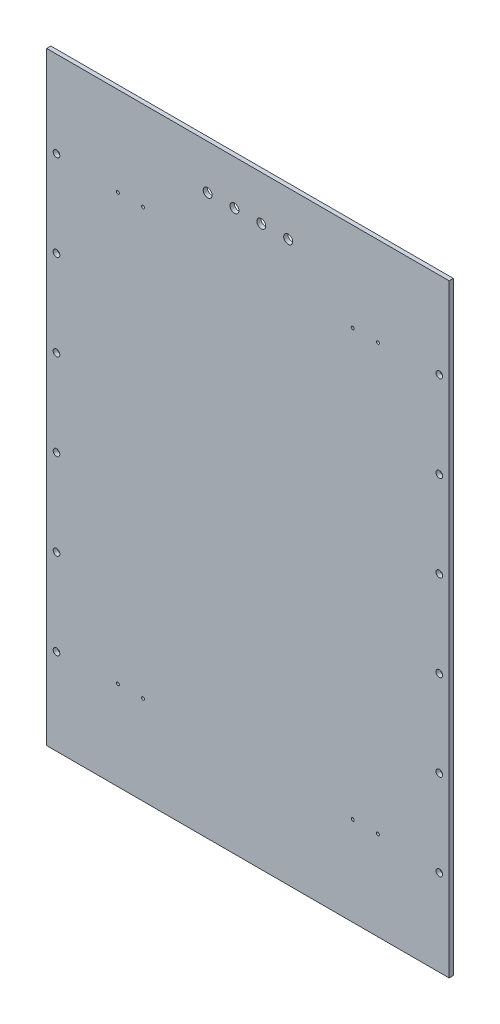
ISO-10303-21;
HEADER;
FILE_DESCRIPTION(('STEP AP214'),'2;1');
FILE_NAME('part.step','',(''),(''),'','','');
FILE_SCHEMA(('AUTOMOTIVE_DESIGN { 1 0 10303 214 1 1 1 1 }'));
ENDSEC;
DATA;
#1=APPLICATION_CONTEXT('core data for automotive mechanical design processes');
#2=APPLICATION_PROTOCOL_DEFINITION('international standard','automotive_design',2000,#1);
#3=PRODUCT_CONTEXT('',#1,'mechanical');
#4=PRODUCT('Part','Part','',(#3));
#5=PRODUCT_RELATED_PRODUCT_CATEGORY('part','',(#4));
#6=PRODUCT_DEFINITION_FORMATION('','',#4);
#7=PRODUCT_DEFINITION_CONTEXT('part definition',#1,'design');
#8=PRODUCT_DEFINITION('design','',#6,#7);
#9=PRODUCT_DEFINITION_SHAPE('','',#8);
#10=(LENGTH_UNIT() NAMED_UNIT(*) SI_UNIT(.MILLI.,.METRE.));
#11=(NAMED_UNIT(*) PLANE_ANGLE_UNIT() SI_UNIT($,.RADIAN.));
#12=(NAMED_UNIT(*) SI_UNIT($,.STERADIAN.) SOLID_ANGLE_UNIT());
#13=UNCERTAINTY_MEASURE_WITH_UNIT(LENGTH_MEASURE(1.E-05),#10,'distance_accuracy_value','');
#14=(GEOMETRIC_REPRESENTATION_CONTEXT(3) GLOBAL_UNCERTAINTY_ASSIGNED_CONTEXT((#13)) GLOBAL_UNIT_ASSIGNED_CONTEXT((#10,
#11,#12)) REPRESENTATION_CONTEXT('',''));
#15=CARTESIAN_POINT('',(0.,0.,0.));
#16=DIRECTION('',(0.,0.,1.));
#17=DIRECTION('',(1.,0.,0.));
#18=AXIS2_PLACEMENT_3D('',#15,#16,#17);
#19=CARTESIAN_POINT('',(0.,0.,3.175));
#20=DIRECTION('',(0.,0.,-1.));
#21=DIRECTION('',(-1.,0.,0.));
#22=AXIS2_PLACEMENT_3D('',#19,#20,#21);
#23=PLANE('',#22);
#24=CARTESIAN_POINT('',(289.8775,195.942856852571,3.175));
#25=DIRECTION('',(0.,0.,1.));
#26=DIRECTION('',(1.,0.,0.));
#27=AXIS2_PLACEMENT_3D('',#24,#25,#26);
#28=CIRCLE('',#27,5.04189999999999);
#29=CARTESIAN_POINT('',(294.9194,195.942856852571,3.175));
#30=VERTEX_POINT('',#29);
#31=EDGE_CURVE('E218',#30,#30,#28,.T.);
#32=ORIENTED_EDGE('',*,*,#31,.F.);
#33=EDGE_LOOP('',(#32));
#34=FACE_BOUND('',#33,.T.);
#35=CARTESIAN_POINT('',(60.9600000000001,389.892639342968,3.175));
#36=DIRECTION('',(0.,0.,-1.));
#37=DIRECTION('',(-1.,0.,0.));
#38=AXIS2_PLACEMENT_3D('',#35,#36,#37);
#39=CIRCLE('',#38,6.74624000000001);
#40=CARTESIAN_POINT('',(54.2137600000001,389.892639342968,3.175));
#41=VERTEX_POINT('',#40);
#42=EDGE_CURVE('E167',#41,#41,#39,.T.);
#43=ORIENTED_EDGE('',*,*,#42,.T.);
#44=EDGE_LOOP('',(#43));
#45=FACE_BOUND('',#44,.T.);
#46=CARTESIAN_POINT('',(-20.3199999999999,389.892639342968,3.175));
#47=DIRECTION('',(0.,0.,-1.));
#48=DIRECTION('',(-1.,0.,0.));
#49=AXIS2_PLACEMENT_3D('',#46,#47,#48);
#50=CIRCLE('',#49,6.74623999999999);
#51=CARTESIAN_POINT('',(-27.0662399999999,389.892639342968,3.175));
#52=VERTEX_POINT('',#51);
#53=EDGE_CURVE('E170',#52,#52,#50,.T.);
#54=ORIENTED_EDGE('',*,*,#53,.T.);
#55=EDGE_LOOP('',(#54));
#56=FACE_BOUND('',#55,.T.);
#57=CARTESIAN_POINT('',(20.3200000000001,389.892639342968,3.175));
#58=DIRECTION('',(0.,0.,-1.));
#59=DIRECTION('',(-1.,0.,0.));
#60=AXIS2_PLACEMENT_3D('',#57,#58,#59);
#61=CIRCLE('',#60,6.74623999999999);
#62=CARTESIAN_POINT('',(13.5737600000001,389.892639342968,3.175));
#63=VERTEX_POINT('',#62);
#64=EDGE_CURVE('E173',#63,#63,#61,.T.);
#65=ORIENTED_EDGE('',*,*,#64,.T.);
#66=EDGE_LOOP('',(#65));
#67=FACE_BOUND('',#66,.T.);
#68=CARTESIAN_POINT('',(-60.9599999999999,389.892639342968,3.175));
#69=DIRECTION('',(0.,0.,-1.));
#70=DIRECTION('',(-1.,0.,0.));
#71=AXIS2_PLACEMENT_3D('',#68,#69,#70);
#72=CIRCLE('',#71,6.74624);
#73=CARTESIAN_POINT('',(-67.7062399999999,389.892639342968,3.175));
#74=VERTEX_POINT('',#73);
#75=EDGE_CURVE('E176',#74,#74,#72,.T.);
#76=ORIENTED_EDGE('',*,*,#75,.T.);
#77=EDGE_LOOP('',(#76));
#78=FACE_BOUND('',#77,.T.);
#79=CARTESIAN_POINT('',(-196.85,-322.2625,3.175));
#80=DIRECTION('',(0.,0.,1.));
#81=DIRECTION('',(1.,0.,0.));
#82=AXIS2_PLACEMENT_3D('',#79,#80,#81);
#83=CIRCLE('',#82,2.2479);
#84=CARTESIAN_POINT('',(-194.6021,-322.2625,3.175));
#85=VERTEX_POINT('',#84);
#86=EDGE_CURVE('E164',#85,#85,#83,.T.);
#87=ORIENTED_EDGE('',*,*,#86,.F.);
#88=EDGE_LOOP('',(#87));
#89=FACE_BOUND('',#88,.T.);
#90=CARTESIAN_POINT('',(-158.75,-322.2625,3.175));
#91=DIRECTION('',(0.,0.,1.));
#92=DIRECTION('',(1.,0.,0.));
#93=AXIS2_PLACEMENT_3D('',#90,#91,#92);
#94=CIRCLE('',#93,2.2479);
#95=CARTESIAN_POINT('',(-156.5021,-322.2625,3.175));
#96=VERTEX_POINT('',#95);
#97=EDGE_CURVE('E158',#96,#96,#94,.T.);
#98=ORIENTED_EDGE('',*,*,#97,.F.);
#99=EDGE_LOOP('',(#98));
#100=FACE_BOUND('',#99,.T.);
#101=CARTESIAN_POINT('',(196.85,-322.2625,3.175));
#102=DIRECTION('',(0.,0.,1.));
#103=DIRECTION('',(1.,0.,0.));
#104=AXIS2_PLACEMENT_3D('',#101,#102,#103);
#105=CIRCLE('',#104,2.2479);
#106=CARTESIAN_POINT('',(199.0979,-322.2625,3.175));
#107=VERTEX_POINT('',#106);
#108=EDGE_CURVE('E152',#107,#107,#105,.T.);
#109=ORIENTED_EDGE('',*,*,#108,.F.);
#110=EDGE_LOOP('',(#109));
#111=FACE_BOUND('',#110,.T.);
#112=CARTESIAN_POINT('',(158.75,-322.2625,3.175));
#113=DIRECTION('',(0.,0.,1.));
#114=DIRECTION('',(1.,0.,0.));
#115=AXIS2_PLACEMENT_3D('',#112,#113,#114);
#116=CIRCLE('',#115,2.2479);
#117=CARTESIAN_POINT('',(160.9979,-322.2625,3.175));
#118=VERTEX_POINT('',#117);
#119=EDGE_CURVE('E146',#118,#118,#116,.T.);
#120=ORIENTED_EDGE('',*,*,#119,.F.);
#121=EDGE_LOOP('',(#120));
#122=FACE_BOUND('',#121,.T.);
#123=CARTESIAN_POINT('',(158.75,322.2625,3.175));
#124=DIRECTION('',(0.,0.,1.));
#125=DIRECTION('',(1.,0.,0.));
#126=AXIS2_PLACEMENT_3D('',#123,#124,#125);
#127=CIRCLE('',#126,2.2479);
#128=CARTESIAN_POINT('',(160.9979,322.2625,3.175));
#129=VERTEX_POINT('',#128);
#130=EDGE_CURVE('E140',#129,#129,#127,.T.);
#131=ORIENTED_EDGE('',*,*,#130,.F.);
#132=EDGE_LOOP('',(#131));
#133=FACE_BOUND('',#132,.T.);
#134=CARTESIAN_POINT('',(196.85,322.2625,3.175));
#135=DIRECTION('',(0.,0.,1.));
#136=DIRECTION('',(1.,0.,0.));
#137=AXIS2_PLACEMENT_3D('',#134,#135,#136);
#138=CIRCLE('',#137,2.2479);
#139=CARTESIAN_POINT('',(199.0979,322.2625,3.175));
#140=VERTEX_POINT('',#139);
#141=EDGE_CURVE('E134',#140,#140,#138,.T.);
#142=ORIENTED_EDGE('',*,*,#141,.F.);
#143=EDGE_LOOP('',(#142));
#144=FACE_BOUND('',#143,.T.);
#145=CARTESIAN_POINT('',(-158.75,322.2625,3.175));
#146=DIRECTION('',(0.,0.,1.));
#147=DIRECTION('',(1.,0.,0.));
#148=AXIS2_PLACEMENT_3D('',#145,#146,#147);
#149=CIRCLE('',#148,2.2479);
#150=CARTESIAN_POINT('',(-156.5021,322.2625,3.175));
#151=VERTEX_POINT('',#150);
#152=EDGE_CURVE('E128',#151,#151,#149,.T.);
#153=ORIENTED_EDGE('',*,*,#152,.F.);
#154=EDGE_LOOP('',(#153));
#155=FACE_BOUND('',#154,.T.);
#156=CARTESIAN_POINT('',(-196.85,322.2625,3.175));
#157=DIRECTION('',(0.,0.,1.));
#158=DIRECTION('',(1.,0.,0.));
#159=AXIS2_PLACEMENT_3D('',#156,#157,#158);
#160=CIRCLE('',#159,2.2479);
#161=CARTESIAN_POINT('',(-194.6021,322.2625,3.175));
#162=VERTEX_POINT('',#161);
#163=EDGE_CURVE('E122',#162,#162,#160,.T.);
#164=ORIENTED_EDGE('',*,*,#163,.F.);
#165=EDGE_LOOP('',(#164));
#166=FACE_BOUND('',#165,.T.);
#167=DIRECTION('',(0.,1.,0.));
#168=VECTOR('',#167,1.);
#169=CARTESIAN_POINT('',(304.8,-457.2,3.175));
#170=LINE('',#169,#168);
#171=CARTESIAN_POINT('',(304.8,-457.2,3.175));
#172=VERTEX_POINT('',#171);
#173=CARTESIAN_POINT('',(304.8,457.2,3.175));
#174=VERTEX_POINT('',#173);
#175=EDGE_CURVE('E94',#172,#174,#170,.T.);
#176=ORIENTED_EDGE('',*,*,#175,.T.);
#177=DIRECTION('',(-1.,0.,0.));
#178=VECTOR('',#177,1.);
#179=CARTESIAN_POINT('',(-304.8,457.2,3.175));
#180=LINE('',#179,#178);
#181=CARTESIAN_POINT('',(-304.8,457.2,3.175));
#182=VERTEX_POINT('',#181);
#183=EDGE_CURVE('E89',#174,#182,#180,.T.);
#184=ORIENTED_EDGE('',*,*,#183,.T.);
#185=DIRECTION('',(0.,-1.,0.));
#186=VECTOR('',#185,1.);
#187=CARTESIAN_POINT('',(-304.8,-457.2,3.175));
#188=LINE('',#187,#186);
#189=CARTESIAN_POINT('',(-304.8,-457.2,3.175));
#190=VERTEX_POINT('',#189);
#191=EDGE_CURVE('E92',#182,#190,#188,.T.);
#192=ORIENTED_EDGE('',*,*,#191,.T.);
#193=DIRECTION('',(1.,0.,0.));
#194=VECTOR('',#193,1.);
#195=CARTESIAN_POINT('',(-304.8,-457.2,3.175));
#196=LINE('',#195,#194);
#197=EDGE_CURVE('E59',#190,#172,#196,.T.);
#198=ORIENTED_EDGE('',*,*,#197,.T.);
#199=EDGE_LOOP('',(#176,#184,#192,#198));
#200=FACE_BOUND('',#199,.T.);
#201=CARTESIAN_POINT('',(289.8775,-326.571428571429,3.175));
#202=DIRECTION('',(0.,0.,1.));
#203=DIRECTION('',(1.,0.,0.));
#204=AXIS2_PLACEMENT_3D('',#201,#202,#203);
#205=CIRCLE('',#204,5.04189999999999);
#206=CARTESIAN_POINT('',(294.9194,-326.571428571429,3.175));
#207=VERTEX_POINT('',#206);
#208=EDGE_CURVE('E194',#207,#207,#205,.T.);
#209=ORIENTED_EDGE('',*,*,#208,.F.);
#210=EDGE_LOOP('',(#209));
#211=FACE_BOUND('',#210,.T.);
#212=CARTESIAN_POINT('',(289.8775,-195.942857215429,3.175));
#213=DIRECTION('',(0.,0.,1.));
#214=DIRECTION('',(1.,0.,0.));
#215=AXIS2_PLACEMENT_3D('',#212,#213,#214);
#216=CIRCLE('',#215,5.04189999999999);
#217=CARTESIAN_POINT('',(294.9194,-195.942857215429,3.175));
#218=VERTEX_POINT('',#217);
#219=EDGE_CURVE('E200',#218,#218,#216,.T.);
#220=ORIENTED_EDGE('',*,*,#219,.F.);
#221=EDGE_LOOP('',(#220));
#222=FACE_BOUND('',#221,.T.);
#223=CARTESIAN_POINT('',(289.8775,-65.3142858594288,3.175));
#224=DIRECTION('',(0.,0.,1.));
#225=DIRECTION('',(1.,0.,0.));
#226=AXIS2_PLACEMENT_3D('',#223,#224,#225);
#227=CIRCLE('',#226,5.04189999999999);
#228=CARTESIAN_POINT('',(294.9194,-65.3142858594288,3.175));
#229=VERTEX_POINT('',#228);
#230=EDGE_CURVE('E206',#229,#229,#227,.T.);
#231=ORIENTED_EDGE('',*,*,#230,.F.);
#232=EDGE_LOOP('',(#231));
#233=FACE_BOUND('',#232,.T.);
#234=CARTESIAN_POINT('',(289.8775,65.3142854965713,3.175));
#235=DIRECTION('',(0.,0.,1.));
#236=DIRECTION('',(1.,0.,0.));
#237=AXIS2_PLACEMENT_3D('',#234,#235,#236);
#238=CIRCLE('',#237,5.04189999999999);
#239=CARTESIAN_POINT('',(294.9194,65.3142854965713,3.175));
#240=VERTEX_POINT('',#239);
#241=EDGE_CURVE('E212',#240,#240,#238,.T.);
#242=ORIENTED_EDGE('',*,*,#241,.F.);
#243=EDGE_LOOP('',(#242));
#244=FACE_BOUND('',#243,.T.);
#245=CARTESIAN_POINT('',(289.8775,326.571428208571,3.175));
#246=DIRECTION('',(0.,0.,1.));
#247=DIRECTION('',(1.,0.,0.));
#248=AXIS2_PLACEMENT_3D('',#245,#246,#247);
#249=CIRCLE('',#248,5.04189999999999);
#250=CARTESIAN_POINT('',(294.9194,326.571428208571,3.175));
#251=VERTEX_POINT('',#250);
#252=EDGE_CURVE('E224',#251,#251,#249,.T.);
#253=ORIENTED_EDGE('',*,*,#252,.F.);
#254=EDGE_LOOP('',(#253));
#255=FACE_BOUND('',#254,.T.);
#256=CARTESIAN_POINT('',(-289.8775,326.571428208571,3.175));
#257=DIRECTION('',(0.,0.,1.));
#258=DIRECTION('',(1.,0.,0.));
#259=AXIS2_PLACEMENT_3D('',#256,#257,#258);
#260=CIRCLE('',#259,5.04189999999999);
#261=CARTESIAN_POINT('',(-284.8356,326.571428208571,3.175));
#262=VERTEX_POINT('',#261);
#263=EDGE_CURVE('E230',#262,#262,#260,.T.);
#264=ORIENTED_EDGE('',*,*,#263,.F.);
#265=EDGE_LOOP('',(#264));
#266=FACE_BOUND('',#265,.T.);
#267=CARTESIAN_POINT('',(-289.8775,195.942856852571,3.175));
#268=DIRECTION('',(0.,0.,1.));
#269=DIRECTION('',(1.,0.,0.));
#270=AXIS2_PLACEMENT_3D('',#267,#268,#269);
#271=CIRCLE('',#270,5.04189999999999);
#272=CARTESIAN_POINT('',(-284.8356,195.942856852571,3.175));
#273=VERTEX_POINT('',#272);
#274=EDGE_CURVE('E236',#273,#273,#271,.T.);
#275=ORIENTED_EDGE('',*,*,#274,.F.);
#276=EDGE_LOOP('',(#275));
#277=FACE_BOUND('',#276,.T.);
#278=CARTESIAN_POINT('',(-289.8775,65.3142854965714,3.175));
#279=DIRECTION('',(0.,0.,1.));
#280=DIRECTION('',(1.,0.,0.));
#281=AXIS2_PLACEMENT_3D('',#278,#279,#280);
#282=CIRCLE('',#281,5.04189999999999);
#283=CARTESIAN_POINT('',(-284.8356,65.3142854965714,3.175));
#284=VERTEX_POINT('',#283);
#285=EDGE_CURVE('E242',#284,#284,#282,.T.);
#286=ORIENTED_EDGE('',*,*,#285,.F.);
#287=EDGE_LOOP('',(#286));
#288=FACE_BOUND('',#287,.T.);
#289=CARTESIAN_POINT('',(-289.8775,-65.3142858594286,3.175));
#290=DIRECTION('',(0.,0.,1.));
#291=DIRECTION('',(1.,0.,0.));
#292=AXIS2_PLACEMENT_3D('',#289,#290,#291);
#293=CIRCLE('',#292,5.04189999999999);
#294=CARTESIAN_POINT('',(-284.8356,-65.3142858594286,3.175));
#295=VERTEX_POINT('',#294);
#296=EDGE_CURVE('E248',#295,#295,#293,.T.);
#297=ORIENTED_EDGE('',*,*,#296,.F.);
#298=EDGE_LOOP('',(#297));
#299=FACE_BOUND('',#298,.T.);
#300=CARTESIAN_POINT('',(-289.8775,-195.942857215429,3.175));
#301=DIRECTION('',(0.,0.,1.));
#302=DIRECTION('',(1.,0.,0.));
#303=AXIS2_PLACEMENT_3D('',#300,#301,#302);
#304=CIRCLE('',#303,5.04189999999999);
#305=CARTESIAN_POINT('',(-284.8356,-195.942857215429,3.175));
#306=VERTEX_POINT('',#305);
#307=EDGE_CURVE('E254',#306,#306,#304,.T.);
#308=ORIENTED_EDGE('',*,*,#307,.F.);
#309=EDGE_LOOP('',(#308));
#310=FACE_BOUND('',#309,.T.);
#311=CARTESIAN_POINT('',(-289.8775,-326.571428571429,3.175));
#312=DIRECTION('',(0.,0.,1.));
#313=DIRECTION('',(1.,0.,0.));
#314=AXIS2_PLACEMENT_3D('',#311,#312,#313);
#315=CIRCLE('',#314,5.04189999999999);
#316=CARTESIAN_POINT('',(-284.8356,-326.571428571429,3.175));
#317=VERTEX_POINT('',#316);
#318=EDGE_CURVE('E260',#317,#317,#315,.T.);
#319=ORIENTED_EDGE('',*,*,#318,.F.);
#320=EDGE_LOOP('',(#319));
#321=FACE_BOUND('',#320,.T.);
#322=ADVANCED_FACE('F42',(#34,#45,#56,#67,#78,#89,#100,#111,#122,#133,#144,#155,#166,#200,#211,
#222,#233,#244,#255,#266,#277,#288,#299,#310,#321),#23,.F.);
#323=CARTESIAN_POINT('',(304.8,-457.2,3.175));
#324=DIRECTION('',(-1.,0.,0.));
#325=DIRECTION('',(0.,0.,1.));
#326=AXIS2_PLACEMENT_3D('',#323,#324,#325);
#327=PLANE('',#326);
#328=DIRECTION('',(0.,1.,0.));
#329=VECTOR('',#328,1.);
#330=CARTESIAN_POINT('',(304.8,-457.2,-3.175));
#331=LINE('',#330,#329);
#332=CARTESIAN_POINT('',(304.8,-457.2,-3.175));
#333=VERTEX_POINT('',#332);
#334=CARTESIAN_POINT('',(304.8,457.2,-3.175));
#335=VERTEX_POINT('',#334);
#336=EDGE_CURVE('E106',#333,#335,#331,.T.);
#337=ORIENTED_EDGE('',*,*,#336,.T.);
#338=DIRECTION('',(0.,0.,-1.));
#339=VECTOR('',#338,1.);
#340=CARTESIAN_POINT('',(304.8,457.2,3.175));
#341=LINE('',#340,#339);
#342=EDGE_CURVE('E11',#174,#335,#341,.T.);
#343=ORIENTED_EDGE('',*,*,#342,.F.);
#344=ORIENTED_EDGE('',*,*,#175,.F.);
#345=DIRECTION('',(0.,0.,-1.));
#346=VECTOR('',#345,1.);
#347=CARTESIAN_POINT('',(304.8,-457.2,3.175));
#348=LINE('',#347,#346);
#349=EDGE_CURVE('E102',#172,#333,#348,.T.);
#350=ORIENTED_EDGE('',*,*,#349,.T.);
#351=EDGE_LOOP('',(#337,#343,#344,#350));
#352=FACE_BOUND('',#351,.T.);
#353=ADVANCED_FACE('F44',(#352),#327,.F.);
#354=CARTESIAN_POINT('',(-304.8,457.2,3.175));
#355=DIRECTION('',(0.,-1.,0.));
#356=DIRECTION('',(0.,0.,-1.));
#357=AXIS2_PLACEMENT_3D('',#354,#355,#356);
#358=PLANE('',#357);
#359=DIRECTION('',(-1.,0.,0.));
#360=VECTOR('',#359,1.);
#361=CARTESIAN_POINT('',(-304.8,457.2,-3.175));
#362=LINE('',#361,#360);
#363=CARTESIAN_POINT('',(-304.8,457.2,-3.175));
#364=VERTEX_POINT('',#363);
#365=EDGE_CURVE('E98',#335,#364,#362,.T.);
#366=ORIENTED_EDGE('',*,*,#365,.T.);
#367=DIRECTION('',(0.,0.,-1.));
#368=VECTOR('',#367,1.);
#369=CARTESIAN_POINT('',(-304.8,457.2,3.175));
#370=LINE('',#369,#368);
#371=EDGE_CURVE('E51',#182,#364,#370,.T.);
#372=ORIENTED_EDGE('',*,*,#371,.F.);
#373=ORIENTED_EDGE('',*,*,#183,.F.);
#374=ORIENTED_EDGE('',*,*,#342,.T.);
#375=EDGE_LOOP('',(#366,#372,#373,#374));
#376=FACE_BOUND('',#375,.T.);
#377=ADVANCED_FACE('F97',(#376),#358,.F.);
#378=CARTESIAN_POINT('',(-304.8,-457.2,3.175));
#379=DIRECTION('',(1.,0.,0.));
#380=DIRECTION('',(0.,0.,-1.));
#381=AXIS2_PLACEMENT_3D('',#378,#379,#380);
#382=PLANE('',#381);
#383=DIRECTION('',(0.,-1.,0.));
#384=VECTOR('',#383,1.);
#385=CARTESIAN_POINT('',(-304.8,-457.2,-3.175));
#386=LINE('',#385,#384);
#387=CARTESIAN_POINT('',(-304.8,-457.2,-3.175));
#388=VERTEX_POINT('',#387);
#389=EDGE_CURVE('E76',#364,#388,#386,.T.);
#390=ORIENTED_EDGE('',*,*,#389,.T.);
#391=DIRECTION('',(0.,0.,-1.));
#392=VECTOR('',#391,1.);
#393=CARTESIAN_POINT('',(-304.8,-457.2,3.175));
#394=LINE('',#393,#392);
#395=EDGE_CURVE('E99',#190,#388,#394,.T.);
#396=ORIENTED_EDGE('',*,*,#395,.F.);
#397=ORIENTED_EDGE('',*,*,#191,.F.);
#398=ORIENTED_EDGE('',*,*,#371,.T.);
#399=EDGE_LOOP('',(#390,#396,#397,#398));
#400=FACE_BOUND('',#399,.T.);
#401=ADVANCED_FACE('F100',(#400),#382,.F.);
#402=CARTESIAN_POINT('',(-304.8,-457.2,3.175));
#403=DIRECTION('',(0.,1.,0.));
#404=DIRECTION('',(0.,0.,1.));
#405=AXIS2_PLACEMENT_3D('',#402,#403,#404);
#406=PLANE('',#405);
#407=DIRECTION('',(1.,0.,0.));
#408=VECTOR('',#407,1.);
#409=CARTESIAN_POINT('',(-304.8,-457.2,-3.175));
#410=LINE('',#409,#408);
#411=EDGE_CURVE('E82',#388,#333,#410,.T.);
#412=ORIENTED_EDGE('',*,*,#411,.T.);
#413=ORIENTED_EDGE('',*,*,#349,.F.);
#414=ORIENTED_EDGE('',*,*,#197,.F.);
#415=ORIENTED_EDGE('',*,*,#395,.T.);
#416=EDGE_LOOP('',(#412,#413,#414,#415));
#417=FACE_BOUND('',#416,.T.);
#418=ADVANCED_FACE('F114',(#417),#406,.F.);
#419=CARTESIAN_POINT('',(0.,0.,-3.175));
#420=DIRECTION('',(0.,0.,-1.));
#421=DIRECTION('',(-1.,0.,0.));
#422=AXIS2_PLACEMENT_3D('',#419,#420,#421);
#423=PLANE('',#422);
#424=CARTESIAN_POINT('',(-289.8775,-326.571428571429,-3.175));
#425=DIRECTION('',(0.,0.,-1.));
#426=DIRECTION('',(-1.,0.,0.));
#427=AXIS2_PLACEMENT_3D('',#424,#425,#426);
#428=CIRCLE('',#427,5.04189999999999);
#429=CARTESIAN_POINT('',(-294.9194,-326.571428571429,-3.175));
#430=VERTEX_POINT('',#429);
#431=EDGE_CURVE('E257',#430,#430,#428,.T.);
#432=ORIENTED_EDGE('',*,*,#431,.F.);
#433=EDGE_LOOP('',(#432));
#434=FACE_BOUND('',#433,.T.);
#435=CARTESIAN_POINT('',(-289.8775,-195.942857215429,-3.175));
#436=DIRECTION('',(0.,0.,-1.));
#437=DIRECTION('',(-1.,0.,0.));
#438=AXIS2_PLACEMENT_3D('',#435,#436,#437);
#439=CIRCLE('',#438,5.04189999999999);
#440=CARTESIAN_POINT('',(-294.9194,-195.942857215429,-3.175));
#441=VERTEX_POINT('',#440);
#442=EDGE_CURVE('E251',#441,#441,#439,.T.);
#443=ORIENTED_EDGE('',*,*,#442,.F.);
#444=EDGE_LOOP('',(#443));
#445=FACE_BOUND('',#444,.T.);
#446=CARTESIAN_POINT('',(-289.8775,-65.3142858594286,-3.175));
#447=DIRECTION('',(0.,0.,-1.));
#448=DIRECTION('',(-1.,0.,0.));
#449=AXIS2_PLACEMENT_3D('',#446,#447,#448);
#450=CIRCLE('',#449,5.04189999999999);
#451=CARTESIAN_POINT('',(-294.9194,-65.3142858594286,-3.175));
#452=VERTEX_POINT('',#451);
#453=EDGE_CURVE('E245',#452,#452,#450,.T.);
#454=ORIENTED_EDGE('',*,*,#453,.F.);
#455=EDGE_LOOP('',(#454));
#456=FACE_BOUND('',#455,.T.);
#457=CARTESIAN_POINT('',(-289.8775,65.3142854965714,-3.175));
#458=DIRECTION('',(0.,0.,-1.));
#459=DIRECTION('',(-1.,0.,0.));
#460=AXIS2_PLACEMENT_3D('',#457,#458,#459);
#461=CIRCLE('',#460,5.04189999999999);
#462=CARTESIAN_POINT('',(-294.9194,65.3142854965714,-3.175));
#463=VERTEX_POINT('',#462);
#464=EDGE_CURVE('E239',#463,#463,#461,.T.);
#465=ORIENTED_EDGE('',*,*,#464,.F.);
#466=EDGE_LOOP('',(#465));
#467=FACE_BOUND('',#466,.T.);
#468=CARTESIAN_POINT('',(-289.8775,195.942856852571,-3.175));
#469=DIRECTION('',(0.,0.,-1.));
#470=DIRECTION('',(-1.,0.,0.));
#471=AXIS2_PLACEMENT_3D('',#468,#469,#470);
#472=CIRCLE('',#471,5.04189999999999);
#473=CARTESIAN_POINT('',(-294.9194,195.942856852571,-3.175));
#474=VERTEX_POINT('',#473);
#475=EDGE_CURVE('E233',#474,#474,#472,.T.);
#476=ORIENTED_EDGE('',*,*,#475,.F.);
#477=EDGE_LOOP('',(#476));
#478=FACE_BOUND('',#477,.T.);
#479=CARTESIAN_POINT('',(-289.8775,326.571428208571,-3.175));
#480=DIRECTION('',(0.,0.,-1.));
#481=DIRECTION('',(-1.,0.,0.));
#482=AXIS2_PLACEMENT_3D('',#479,#480,#481);
#483=CIRCLE('',#482,5.04189999999999);
#484=CARTESIAN_POINT('',(-294.9194,326.571428208571,-3.175));
#485=VERTEX_POINT('',#484);
#486=EDGE_CURVE('E227',#485,#485,#483,.T.);
#487=ORIENTED_EDGE('',*,*,#486,.F.);
#488=EDGE_LOOP('',(#487));
#489=FACE_BOUND('',#488,.T.);
#490=CARTESIAN_POINT('',(289.8775,326.571428208571,-3.175));
#491=DIRECTION('',(0.,0.,-1.));
#492=DIRECTION('',(-1.,0.,0.));
#493=AXIS2_PLACEMENT_3D('',#490,#491,#492);
#494=CIRCLE('',#493,5.04189999999999);
#495=CARTESIAN_POINT('',(284.8356,326.571428208571,-3.175));
#496=VERTEX_POINT('',#495);
#497=EDGE_CURVE('E221',#496,#496,#494,.T.);
#498=ORIENTED_EDGE('',*,*,#497,.F.);
#499=EDGE_LOOP('',(#498));
#500=FACE_BOUND('',#499,.T.);
#501=CARTESIAN_POINT('',(289.8775,195.942856852571,-3.175));
#502=DIRECTION('',(0.,0.,-1.));
#503=DIRECTION('',(-1.,0.,0.));
#504=AXIS2_PLACEMENT_3D('',#501,#502,#503);
#505=CIRCLE('',#504,5.04189999999999);
#506=CARTESIAN_POINT('',(284.8356,195.942856852571,-3.175));
#507=VERTEX_POINT('',#506);
#508=EDGE_CURVE('E215',#507,#507,#505,.T.);
#509=ORIENTED_EDGE('',*,*,#508,.F.);
#510=EDGE_LOOP('',(#509));
#511=FACE_BOUND('',#510,.T.);
#512=CARTESIAN_POINT('',(289.8775,65.3142854965713,-3.175));
#513=DIRECTION('',(0.,0.,-1.));
#514=DIRECTION('',(-1.,0.,0.));
#515=AXIS2_PLACEMENT_3D('',#512,#513,#514);
#516=CIRCLE('',#515,5.04189999999999);
#517=CARTESIAN_POINT('',(284.8356,65.3142854965713,-3.175));
#518=VERTEX_POINT('',#517);
#519=EDGE_CURVE('E209',#518,#518,#516,.T.);
#520=ORIENTED_EDGE('',*,*,#519,.F.);
#521=EDGE_LOOP('',(#520));
#522=FACE_BOUND('',#521,.T.);
#523=CARTESIAN_POINT('',(289.8775,-65.3142858594288,-3.175));
#524=DIRECTION('',(0.,0.,-1.));
#525=DIRECTION('',(-1.,0.,0.));
#526=AXIS2_PLACEMENT_3D('',#523,#524,#525);
#527=CIRCLE('',#526,5.04189999999999);
#528=CARTESIAN_POINT('',(284.8356,-65.3142858594288,-3.175));
#529=VERTEX_POINT('',#528);
#530=EDGE_CURVE('E203',#529,#529,#527,.T.);
#531=ORIENTED_EDGE('',*,*,#530,.F.);
#532=EDGE_LOOP('',(#531));
#533=FACE_BOUND('',#532,.T.);
#534=CARTESIAN_POINT('',(289.8775,-195.942857215429,-3.175));
#535=DIRECTION('',(0.,0.,-1.));
#536=DIRECTION('',(-1.,0.,0.));
#537=AXIS2_PLACEMENT_3D('',#534,#535,#536);
#538=CIRCLE('',#537,5.04189999999999);
#539=CARTESIAN_POINT('',(284.8356,-195.942857215429,-3.175));
#540=VERTEX_POINT('',#539);
#541=EDGE_CURVE('E197',#540,#540,#538,.T.);
#542=ORIENTED_EDGE('',*,*,#541,.F.);
#543=EDGE_LOOP('',(#542));
#544=FACE_BOUND('',#543,.T.);
#545=CARTESIAN_POINT('',(289.8775,-326.571428571429,-3.175));
#546=DIRECTION('',(0.,0.,-1.));
#547=DIRECTION('',(-1.,0.,0.));
#548=AXIS2_PLACEMENT_3D('',#545,#546,#547);
#549=CIRCLE('',#548,5.04189999999999);
#550=CARTESIAN_POINT('',(284.8356,-326.571428571429,-3.175));
#551=VERTEX_POINT('',#550);
#552=EDGE_CURVE('E184',#551,#551,#549,.T.);
#553=ORIENTED_EDGE('',*,*,#552,.F.);
#554=EDGE_LOOP('',(#553));
#555=FACE_BOUND('',#554,.T.);
#556=CARTESIAN_POINT('',(60.9600000000001,389.892639342968,-3.175));
#557=DIRECTION('',(0.,0.,1.));
#558=DIRECTION('',(1.,0.,0.));
#559=AXIS2_PLACEMENT_3D('',#556,#557,#558);
#560=CIRCLE('',#559,6.74624000000001);
#561=CARTESIAN_POINT('',(67.7062400000001,389.892639342968,-3.175));
#562=VERTEX_POINT('',#561);
#563=EDGE_CURVE('E179',#562,#562,#560,.T.);
#564=ORIENTED_EDGE('',*,*,#563,.T.);
#565=EDGE_LOOP('',(#564));
#566=FACE_BOUND('',#565,.T.);
#567=CARTESIAN_POINT('',(-20.3199999999999,389.892639342968,-3.175));
#568=DIRECTION('',(0.,0.,1.));
#569=DIRECTION('',(1.,0.,0.));
#570=AXIS2_PLACEMENT_3D('',#567,#568,#569);
#571=CIRCLE('',#570,6.74623999999999);
#572=CARTESIAN_POINT('',(-13.5737599999999,389.892639342968,-3.175));
#573=VERTEX_POINT('',#572);
#574=EDGE_CURVE('E187',#573,#573,#571,.T.);
#575=ORIENTED_EDGE('',*,*,#574,.T.);
#576=EDGE_LOOP('',(#575));
#577=FACE_BOUND('',#576,.T.);
#578=CARTESIAN_POINT('',(20.3200000000001,389.892639342968,-3.175));
#579=DIRECTION('',(0.,0.,1.));
#580=DIRECTION('',(1.,0.,0.));
#581=AXIS2_PLACEMENT_3D('',#578,#579,#580);
#582=CIRCLE('',#581,6.74623999999999);
#583=CARTESIAN_POINT('',(27.0662400000001,389.892639342968,-3.175));
#584=VERTEX_POINT('',#583);
#585=EDGE_CURVE('E183',#584,#584,#582,.T.);
#586=ORIENTED_EDGE('',*,*,#585,.T.);
#587=EDGE_LOOP('',(#586));
#588=FACE_BOUND('',#587,.T.);
#589=CARTESIAN_POINT('',(-60.9599999999999,389.892639342968,-3.175));
#590=DIRECTION('',(0.,0.,1.));
#591=DIRECTION('',(1.,0.,0.));
#592=AXIS2_PLACEMENT_3D('',#589,#590,#591);
#593=CIRCLE('',#592,6.74624);
#594=CARTESIAN_POINT('',(-54.2137599999999,389.892639342968,-3.175));
#595=VERTEX_POINT('',#594);
#596=EDGE_CURVE('E180',#595,#595,#593,.T.);
#597=ORIENTED_EDGE('',*,*,#596,.T.);
#598=EDGE_LOOP('',(#597));
#599=FACE_BOUND('',#598,.T.);
#600=CARTESIAN_POINT('',(-196.85,-322.2625,-3.175));
#601=DIRECTION('',(0.,0.,-1.));
#602=DIRECTION('',(-1.,0.,0.));
#603=AXIS2_PLACEMENT_3D('',#600,#601,#602);
#604=CIRCLE('',#603,2.2479);
#605=CARTESIAN_POINT('',(-199.0979,-322.2625,-3.175));
#606=VERTEX_POINT('',#605);
#607=EDGE_CURVE('E161',#606,#606,#604,.T.);
#608=ORIENTED_EDGE('',*,*,#607,.F.);
#609=EDGE_LOOP('',(#608));
#610=FACE_BOUND('',#609,.T.);
#611=CARTESIAN_POINT('',(-158.75,-322.2625,-3.175));
#612=DIRECTION('',(0.,0.,-1.));
#613=DIRECTION('',(-1.,0.,0.));
#614=AXIS2_PLACEMENT_3D('',#611,#612,#613);
#615=CIRCLE('',#614,2.2479);
#616=CARTESIAN_POINT('',(-160.9979,-322.2625,-3.175));
#617=VERTEX_POINT('',#616);
#618=EDGE_CURVE('E155',#617,#617,#615,.T.);
#619=ORIENTED_EDGE('',*,*,#618,.F.);
#620=EDGE_LOOP('',(#619));
#621=FACE_BOUND('',#620,.T.);
#622=CARTESIAN_POINT('',(196.85,-322.2625,-3.175));
#623=DIRECTION('',(0.,0.,-1.));
#624=DIRECTION('',(-1.,0.,0.));
#625=AXIS2_PLACEMENT_3D('',#622,#623,#624);
#626=CIRCLE('',#625,2.2479);
#627=CARTESIAN_POINT('',(194.6021,-322.2625,-3.175));
#628=VERTEX_POINT('',#627);
#629=EDGE_CURVE('E149',#628,#628,#626,.T.);
#630=ORIENTED_EDGE('',*,*,#629,.F.);
#631=EDGE_LOOP('',(#630));
#632=FACE_BOUND('',#631,.T.);
#633=CARTESIAN_POINT('',(158.75,-322.2625,-3.175));
#634=DIRECTION('',(0.,0.,-1.));
#635=DIRECTION('',(-1.,0.,0.));
#636=AXIS2_PLACEMENT_3D('',#633,#634,#635);
#637=CIRCLE('',#636,2.2479);
#638=CARTESIAN_POINT('',(156.5021,-322.2625,-3.175));
#639=VERTEX_POINT('',#638);
#640=EDGE_CURVE('E143',#639,#639,#637,.T.);
#641=ORIENTED_EDGE('',*,*,#640,.F.);
#642=EDGE_LOOP('',(#641));
#643=FACE_BOUND('',#642,.T.);
#644=CARTESIAN_POINT('',(158.75,322.2625,-3.175));
#645=DIRECTION('',(0.,0.,-1.));
#646=DIRECTION('',(-1.,0.,0.));
#647=AXIS2_PLACEMENT_3D('',#644,#645,#646);
#648=CIRCLE('',#647,2.2479);
#649=CARTESIAN_POINT('',(156.5021,322.2625,-3.175));
#650=VERTEX_POINT('',#649);
#651=EDGE_CURVE('E137',#650,#650,#648,.T.);
#652=ORIENTED_EDGE('',*,*,#651,.F.);
#653=EDGE_LOOP('',(#652));
#654=FACE_BOUND('',#653,.T.);
#655=CARTESIAN_POINT('',(196.85,322.2625,-3.175));
#656=DIRECTION('',(0.,0.,-1.));
#657=DIRECTION('',(-1.,0.,0.));
#658=AXIS2_PLACEMENT_3D('',#655,#656,#657);
#659=CIRCLE('',#658,2.2479);
#660=CARTESIAN_POINT('',(194.6021,322.2625,-3.175));
#661=VERTEX_POINT('',#660);
#662=EDGE_CURVE('E131',#661,#661,#659,.T.);
#663=ORIENTED_EDGE('',*,*,#662,.F.);
#664=EDGE_LOOP('',(#663));
#665=FACE_BOUND('',#664,.T.);
#666=CARTESIAN_POINT('',(-158.75,322.2625,-3.175));
#667=DIRECTION('',(0.,0.,-1.));
#668=DIRECTION('',(-1.,0.,0.));
#669=AXIS2_PLACEMENT_3D('',#666,#667,#668);
#670=CIRCLE('',#669,2.2479);
#671=CARTESIAN_POINT('',(-160.9979,322.2625,-3.175));
#672=VERTEX_POINT('',#671);
#673=EDGE_CURVE('E125',#672,#672,#670,.T.);
#674=ORIENTED_EDGE('',*,*,#673,.F.);
#675=EDGE_LOOP('',(#674));
#676=FACE_BOUND('',#675,.T.);
#677=CARTESIAN_POINT('',(-196.85,322.2625,-3.175));
#678=DIRECTION('',(0.,0.,-1.));
#679=DIRECTION('',(-1.,0.,0.));
#680=AXIS2_PLACEMENT_3D('',#677,#678,#679);
#681=CIRCLE('',#680,2.2479);
#682=CARTESIAN_POINT('',(-199.0979,322.2625,-3.175));
#683=VERTEX_POINT('',#682);
#684=EDGE_CURVE('E109',#683,#683,#681,.T.);
#685=ORIENTED_EDGE('',*,*,#684,.F.);
#686=EDGE_LOOP('',(#685));
#687=FACE_BOUND('',#686,.T.);
#688=ORIENTED_EDGE('',*,*,#336,.F.);
#689=ORIENTED_EDGE('',*,*,#411,.F.);
#690=ORIENTED_EDGE('',*,*,#389,.F.);
#691=ORIENTED_EDGE('',*,*,#365,.F.);
#692=EDGE_LOOP('',(#688,#689,#690,#691));
#693=FACE_BOUND('',#692,.T.);
#694=ADVANCED_FACE('F117',(#434,#445,#456,#467,#478,#489,#500,#511,#522,#533,#544,#555,#566,
#577,#588,#599,#610,#621,#632,#643,#654,#665,#676,#687,#693),#423,.T.);
#695=CARTESIAN_POINT('',(-196.85,322.2625,3.175));
#696=DIRECTION('',(0.,0.,1.));
#697=DIRECTION('',(1.,0.,0.));
#698=AXIS2_PLACEMENT_3D('',#695,#696,#697);
#699=CYLINDRICAL_SURFACE('',#698,2.2479);
#700=ORIENTED_EDGE('',*,*,#163,.T.);
#701=EDGE_LOOP('',(#700));
#702=FACE_BOUND('',#701,.T.);
#703=ORIENTED_EDGE('',*,*,#684,.T.);
#704=EDGE_LOOP('',(#703));
#705=FACE_BOUND('',#704,.T.);
#706=ADVANCED_FACE('F279',(#702,#705),#699,.F.);
#707=CARTESIAN_POINT('',(-158.75,322.2625,3.175));
#708=DIRECTION('',(0.,0.,1.));
#709=DIRECTION('',(1.,0.,0.));
#710=AXIS2_PLACEMENT_3D('',#707,#708,#709);
#711=CYLINDRICAL_SURFACE('',#710,2.2479);
#712=ORIENTED_EDGE('',*,*,#152,.T.);
#713=EDGE_LOOP('',(#712));
#714=FACE_BOUND('',#713,.T.);
#715=ORIENTED_EDGE('',*,*,#673,.T.);
#716=EDGE_LOOP('',(#715));
#717=FACE_BOUND('',#716,.T.);
#718=ADVANCED_FACE('F309',(#714,#717),#711,.F.);
#719=CARTESIAN_POINT('',(196.85,322.2625,3.175));
#720=DIRECTION('',(0.,0.,1.));
#721=DIRECTION('',(1.,0.,0.));
#722=AXIS2_PLACEMENT_3D('',#719,#720,#721);
#723=CYLINDRICAL_SURFACE('',#722,2.2479);
#724=ORIENTED_EDGE('',*,*,#141,.T.);
#725=EDGE_LOOP('',(#724));
#726=FACE_BOUND('',#725,.T.);
#727=ORIENTED_EDGE('',*,*,#662,.T.);
#728=EDGE_LOOP('',(#727));
#729=FACE_BOUND('',#728,.T.);
#730=ADVANCED_FACE('F317',(#726,#729),#723,.F.);
#731=CARTESIAN_POINT('',(158.75,322.2625,3.175));
#732=DIRECTION('',(0.,0.,1.));
#733=DIRECTION('',(1.,0.,0.));
#734=AXIS2_PLACEMENT_3D('',#731,#732,#733);
#735=CYLINDRICAL_SURFACE('',#734,2.2479);
#736=ORIENTED_EDGE('',*,*,#130,.T.);
#737=EDGE_LOOP('',(#736));
#738=FACE_BOUND('',#737,.T.);
#739=ORIENTED_EDGE('',*,*,#651,.T.);
#740=EDGE_LOOP('',(#739));
#741=FACE_BOUND('',#740,.T.);
#742=ADVANCED_FACE('F325',(#738,#741),#735,.F.);
#743=CARTESIAN_POINT('',(158.75,-322.2625,3.175));
#744=DIRECTION('',(0.,0.,1.));
#745=DIRECTION('',(1.,0.,0.));
#746=AXIS2_PLACEMENT_3D('',#743,#744,#745);
#747=CYLINDRICAL_SURFACE('',#746,2.2479);
#748=ORIENTED_EDGE('',*,*,#119,.T.);
#749=EDGE_LOOP('',(#748));
#750=FACE_BOUND('',#749,.T.);
#751=ORIENTED_EDGE('',*,*,#640,.T.);
#752=EDGE_LOOP('',(#751));
#753=FACE_BOUND('',#752,.T.);
#754=ADVANCED_FACE('F334',(#750,#753),#747,.F.);
#755=CARTESIAN_POINT('',(196.85,-322.2625,3.175));
#756=DIRECTION('',(0.,0.,1.));
#757=DIRECTION('',(1.,0.,0.));
#758=AXIS2_PLACEMENT_3D('',#755,#756,#757);
#759=CYLINDRICAL_SURFACE('',#758,2.2479);
#760=ORIENTED_EDGE('',*,*,#108,.T.);
#761=EDGE_LOOP('',(#760));
#762=FACE_BOUND('',#761,.T.);
#763=ORIENTED_EDGE('',*,*,#629,.T.);
#764=EDGE_LOOP('',(#763));
#765=FACE_BOUND('',#764,.T.);
#766=ADVANCED_FACE('F343',(#762,#765),#759,.F.);
#767=CARTESIAN_POINT('',(-158.75,-322.2625,3.175));
#768=DIRECTION('',(0.,0.,1.));
#769=DIRECTION('',(1.,0.,0.));
#770=AXIS2_PLACEMENT_3D('',#767,#768,#769);
#771=CYLINDRICAL_SURFACE('',#770,2.2479);
#772=ORIENTED_EDGE('',*,*,#97,.T.);
#773=EDGE_LOOP('',(#772));
#774=FACE_BOUND('',#773,.T.);
#775=ORIENTED_EDGE('',*,*,#618,.T.);
#776=EDGE_LOOP('',(#775));
#777=FACE_BOUND('',#776,.T.);
#778=ADVANCED_FACE('F352',(#774,#777),#771,.F.);
#779=CARTESIAN_POINT('',(-196.85,-322.2625,3.175));
#780=DIRECTION('',(0.,0.,1.));
#781=DIRECTION('',(1.,0.,0.));
#782=AXIS2_PLACEMENT_3D('',#779,#780,#781);
#783=CYLINDRICAL_SURFACE('',#782,2.2479);
#784=ORIENTED_EDGE('',*,*,#86,.T.);
#785=EDGE_LOOP('',(#784));
#786=FACE_BOUND('',#785,.T.);
#787=ORIENTED_EDGE('',*,*,#607,.T.);
#788=EDGE_LOOP('',(#787));
#789=FACE_BOUND('',#788,.T.);
#790=ADVANCED_FACE('F361',(#786,#789),#783,.F.);
#791=CARTESIAN_POINT('',(-60.9599999999999,389.892639342968,-3.175));
#792=DIRECTION('',(0.,0.,1.));
#793=DIRECTION('',(1.,0.,0.));
#794=AXIS2_PLACEMENT_3D('',#791,#792,#793);
#795=CYLINDRICAL_SURFACE('',#794,6.74624);
#796=ORIENTED_EDGE('',*,*,#596,.F.);
#797=EDGE_LOOP('',(#796));
#798=FACE_BOUND('',#797,.T.);
#799=ORIENTED_EDGE('',*,*,#75,.F.);
#800=EDGE_LOOP('',(#799));
#801=FACE_BOUND('',#800,.T.);
#802=ADVANCED_FACE('F370',(#798,#801),#795,.F.);
#803=CARTESIAN_POINT('',(20.3200000000001,389.892639342968,-3.175));
#804=DIRECTION('',(0.,0.,1.));
#805=DIRECTION('',(1.,0.,0.));
#806=AXIS2_PLACEMENT_3D('',#803,#804,#805);
#807=CYLINDRICAL_SURFACE('',#806,6.74623999999999);
#808=ORIENTED_EDGE('',*,*,#585,.F.);
#809=EDGE_LOOP('',(#808));
#810=FACE_BOUND('',#809,.T.);
#811=ORIENTED_EDGE('',*,*,#64,.F.);
#812=EDGE_LOOP('',(#811));
#813=FACE_BOUND('',#812,.T.);
#814=ADVANCED_FACE('F379',(#810,#813),#807,.F.);
#815=CARTESIAN_POINT('',(-20.3199999999999,389.892639342968,-3.175));
#816=DIRECTION('',(0.,0.,1.));
#817=DIRECTION('',(1.,0.,0.));
#818=AXIS2_PLACEMENT_3D('',#815,#816,#817);
#819=CYLINDRICAL_SURFACE('',#818,6.74623999999999);
#820=ORIENTED_EDGE('',*,*,#574,.F.);
#821=EDGE_LOOP('',(#820));
#822=FACE_BOUND('',#821,.T.);
#823=ORIENTED_EDGE('',*,*,#53,.F.);
#824=EDGE_LOOP('',(#823));
#825=FACE_BOUND('',#824,.T.);
#826=ADVANCED_FACE('F388',(#822,#825),#819,.F.);
#827=CARTESIAN_POINT('',(60.9600000000001,389.892639342968,-3.175));
#828=DIRECTION('',(0.,0.,1.));
#829=DIRECTION('',(1.,0.,0.));
#830=AXIS2_PLACEMENT_3D('',#827,#828,#829);
#831=CYLINDRICAL_SURFACE('',#830,6.74624000000001);
#832=ORIENTED_EDGE('',*,*,#563,.F.);
#833=EDGE_LOOP('',(#832));
#834=FACE_BOUND('',#833,.T.);
#835=ORIENTED_EDGE('',*,*,#42,.F.);
#836=EDGE_LOOP('',(#835));
#837=FACE_BOUND('',#836,.T.);
#838=ADVANCED_FACE('F396',(#834,#837),#831,.F.);
#839=CARTESIAN_POINT('',(289.8775,-326.571428571429,3.175));
#840=DIRECTION('',(0.,0.,1.));
#841=DIRECTION('',(1.,0.,0.));
#842=AXIS2_PLACEMENT_3D('',#839,#840,#841);
#843=CYLINDRICAL_SURFACE('',#842,5.04189999999999);
#844=ORIENTED_EDGE('',*,*,#208,.T.);
#845=EDGE_LOOP('',(#844));
#846=FACE_BOUND('',#845,.T.);
#847=ORIENTED_EDGE('',*,*,#552,.T.);
#848=EDGE_LOOP('',(#847));
#849=FACE_BOUND('',#848,.T.);
#850=ADVANCED_FACE('F404',(#846,#849),#843,.F.);
#851=CARTESIAN_POINT('',(289.8775,-195.942857215429,3.175));
#852=DIRECTION('',(0.,0.,1.));
#853=DIRECTION('',(1.,0.,0.));
#854=AXIS2_PLACEMENT_3D('',#851,#852,#853);
#855=CYLINDRICAL_SURFACE('',#854,5.04189999999999);
#856=ORIENTED_EDGE('',*,*,#219,.T.);
#857=EDGE_LOOP('',(#856));
#858=FACE_BOUND('',#857,.T.);
#859=ORIENTED_EDGE('',*,*,#541,.T.);
#860=EDGE_LOOP('',(#859));
#861=FACE_BOUND('',#860,.T.);
#862=ADVANCED_FACE('F421',(#858,#861),#855,.F.);
#863=CARTESIAN_POINT('',(289.8775,-65.3142858594288,3.175));
#864=DIRECTION('',(0.,0.,1.));
#865=DIRECTION('',(1.,0.,0.));
#866=AXIS2_PLACEMENT_3D('',#863,#864,#865);
#867=CYLINDRICAL_SURFACE('',#866,5.04189999999999);
#868=ORIENTED_EDGE('',*,*,#230,.T.);
#869=EDGE_LOOP('',(#868));
#870=FACE_BOUND('',#869,.T.);
#871=ORIENTED_EDGE('',*,*,#530,.T.);
#872=EDGE_LOOP('',(#871));
#873=FACE_BOUND('',#872,.T.);
#874=ADVANCED_FACE('F431',(#870,#873),#867,.F.);
#875=CARTESIAN_POINT('',(289.8775,65.3142854965713,3.175));
#876=DIRECTION('',(0.,0.,1.));
#877=DIRECTION('',(1.,0.,0.));
#878=AXIS2_PLACEMENT_3D('',#875,#876,#877);
#879=CYLINDRICAL_SURFACE('',#878,5.04189999999999);
#880=ORIENTED_EDGE('',*,*,#241,.T.);
#881=EDGE_LOOP('',(#880));
#882=FACE_BOUND('',#881,.T.);
#883=ORIENTED_EDGE('',*,*,#519,.T.);
#884=EDGE_LOOP('',(#883));
#885=FACE_BOUND('',#884,.T.);
#886=ADVANCED_FACE('F441',(#882,#885),#879,.F.);
#887=CARTESIAN_POINT('',(289.8775,195.942856852571,3.175));
#888=DIRECTION('',(0.,0.,1.));
#889=DIRECTION('',(1.,0.,0.));
#890=AXIS2_PLACEMENT_3D('',#887,#888,#889);
#891=CYLINDRICAL_SURFACE('',#890,5.04189999999999);
#892=ORIENTED_EDGE('',*,*,#31,.T.);
#893=EDGE_LOOP('',(#892));
#894=FACE_BOUND('',#893,.T.);
#895=ORIENTED_EDGE('',*,*,#508,.T.);
#896=EDGE_LOOP('',(#895));
#897=FACE_BOUND('',#896,.T.);
#898=ADVANCED_FACE('F451',(#894,#897),#891,.F.);
#899=CARTESIAN_POINT('',(289.8775,326.571428208571,3.175));
#900=DIRECTION('',(0.,0.,1.));
#901=DIRECTION('',(1.,0.,0.));
#902=AXIS2_PLACEMENT_3D('',#899,#900,#901);
#903=CYLINDRICAL_SURFACE('',#902,5.04189999999999);
#904=ORIENTED_EDGE('',*,*,#252,.T.);
#905=EDGE_LOOP('',(#904));
#906=FACE_BOUND('',#905,.T.);
#907=ORIENTED_EDGE('',*,*,#497,.T.);
#908=EDGE_LOOP('',(#907));
#909=FACE_BOUND('',#908,.T.);
#910=ADVANCED_FACE('F461',(#906,#909),#903,.F.);
#911=CARTESIAN_POINT('',(-289.8775,326.571428208571,3.175));
#912=DIRECTION('',(0.,0.,1.));
#913=DIRECTION('',(1.,0.,0.));
#914=AXIS2_PLACEMENT_3D('',#911,#912,#913);
#915=CYLINDRICAL_SURFACE('',#914,5.04189999999999);
#916=ORIENTED_EDGE('',*,*,#263,.T.);
#917=EDGE_LOOP('',(#916));
#918=FACE_BOUND('',#917,.T.);
#919=ORIENTED_EDGE('',*,*,#486,.T.);
#920=EDGE_LOOP('',(#919));
#921=FACE_BOUND('',#920,.T.);
#922=ADVANCED_FACE('F471',(#918,#921),#915,.F.);
#923=CARTESIAN_POINT('',(-289.8775,195.942856852571,3.175));
#924=DIRECTION('',(0.,0.,1.));
#925=DIRECTION('',(1.,0.,0.));
#926=AXIS2_PLACEMENT_3D('',#923,#924,#925);
#927=CYLINDRICAL_SURFACE('',#926,5.04189999999999);
#928=ORIENTED_EDGE('',*,*,#274,.T.);
#929=EDGE_LOOP('',(#928));
#930=FACE_BOUND('',#929,.T.);
#931=ORIENTED_EDGE('',*,*,#475,.T.);
#932=EDGE_LOOP('',(#931));
#933=FACE_BOUND('',#932,.T.);
#934=ADVANCED_FACE('F481',(#930,#933),#927,.F.);
#935=CARTESIAN_POINT('',(-289.8775,65.3142854965714,3.175));
#936=DIRECTION('',(0.,0.,1.));
#937=DIRECTION('',(1.,0.,0.));
#938=AXIS2_PLACEMENT_3D('',#935,#936,#937);
#939=CYLINDRICAL_SURFACE('',#938,5.04189999999999);
#940=ORIENTED_EDGE('',*,*,#285,.T.);
#941=EDGE_LOOP('',(#940));
#942=FACE_BOUND('',#941,.T.);
#943=ORIENTED_EDGE('',*,*,#464,.T.);
#944=EDGE_LOOP('',(#943));
#945=FACE_BOUND('',#944,.T.);
#946=ADVANCED_FACE('F491',(#942,#945),#939,.F.);
#947=CARTESIAN_POINT('',(-289.8775,-65.3142858594286,3.175));
#948=DIRECTION('',(0.,0.,1.));
#949=DIRECTION('',(1.,0.,0.));
#950=AXIS2_PLACEMENT_3D('',#947,#948,#949);
#951=CYLINDRICAL_SURFACE('',#950,5.04189999999999);
#952=ORIENTED_EDGE('',*,*,#296,.T.);
#953=EDGE_LOOP('',(#952));
#954=FACE_BOUND('',#953,.T.);
#955=ORIENTED_EDGE('',*,*,#453,.T.);
#956=EDGE_LOOP('',(#955));
#957=FACE_BOUND('',#956,.T.);
#958=ADVANCED_FACE('F501',(#954,#957),#951,.F.);
#959=CARTESIAN_POINT('',(-289.8775,-195.942857215429,3.175));
#960=DIRECTION('',(0.,0.,1.));
#961=DIRECTION('',(1.,0.,0.));
#962=AXIS2_PLACEMENT_3D('',#959,#960,#961);
#963=CYLINDRICAL_SURFACE('',#962,5.04189999999999);
#964=ORIENTED_EDGE('',*,*,#307,.T.);
#965=EDGE_LOOP('',(#964));
#966=FACE_BOUND('',#965,.T.);
#967=ORIENTED_EDGE('',*,*,#442,.T.);
#968=EDGE_LOOP('',(#967));
#969=FACE_BOUND('',#968,.T.);
#970=ADVANCED_FACE('F511',(#966,#969),#963,.F.);
#971=CARTESIAN_POINT('',(-289.8775,-326.571428571429,3.175));
#972=DIRECTION('',(0.,0.,1.));
#973=DIRECTION('',(1.,0.,0.));
#974=AXIS2_PLACEMENT_3D('',#971,#972,#973);
#975=CYLINDRICAL_SURFACE('',#974,5.04189999999999);
#976=ORIENTED_EDGE('',*,*,#318,.T.);
#977=EDGE_LOOP('',(#976));
#978=FACE_BOUND('',#977,.T.);
#979=ORIENTED_EDGE('',*,*,#431,.T.);
#980=EDGE_LOOP('',(#979));
#981=FACE_BOUND('',#980,.T.);
#982=ADVANCED_FACE('F264',(#978,#981),#975,.F.);
#983=CLOSED_SHELL('',(#322,#353,#377,#401,#418,#694,#706,#718,#730,#742,#754,#766,#778,#790,
#802,#814,#826,#838,#850,#862,#874,#886,#898,#910,#922,#934,#946,#958,#970,#982));
#984=MANIFOLD_SOLID_BREP('B2',#983);
#985=ADVANCED_BREP_SHAPE_REPRESENTATION('',(#18,#984),#14);
#986=SHAPE_DEFINITION_REPRESENTATION(#9,#985);
ENDSEC;
END-ISO-10303-21;
